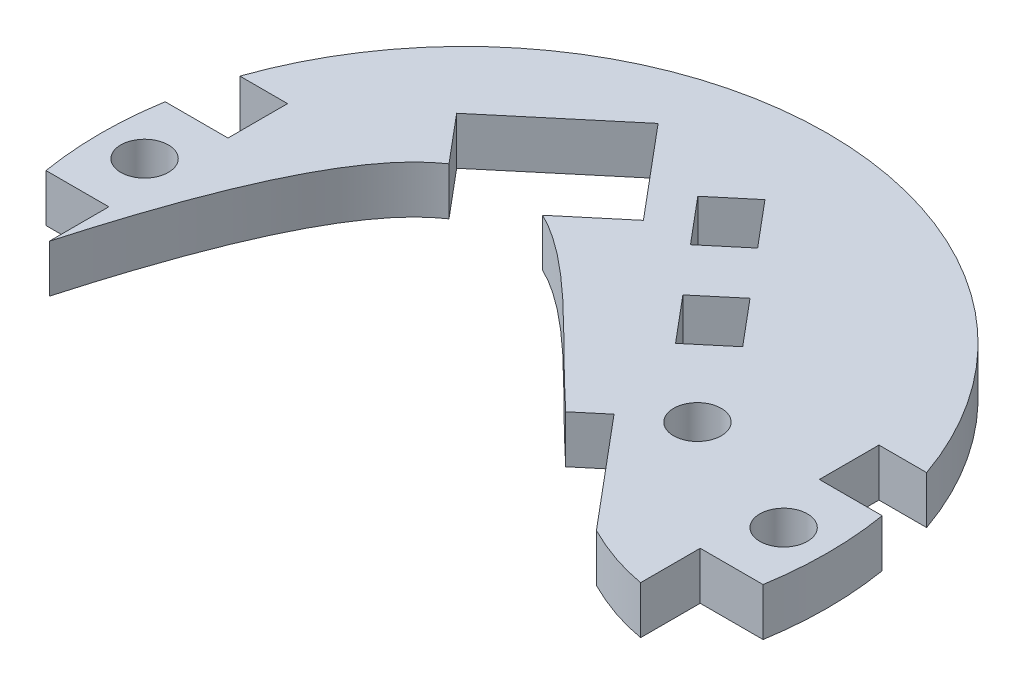
ISO-10303-21;
HEADER;
FILE_DESCRIPTION(('STEP AP214'),'2;1');
FILE_NAME('part.step','',(''),(''),'','','');
FILE_SCHEMA(('AUTOMOTIVE_DESIGN { 1 0 10303 214 1 1 1 1 }'));
ENDSEC;
DATA;
#1=APPLICATION_CONTEXT('core data for automotive mechanical design processes');
#2=APPLICATION_PROTOCOL_DEFINITION('international standard','automotive_design',2000,#1);
#3=PRODUCT_CONTEXT('',#1,'mechanical');
#4=PRODUCT('Part','Part','',(#3));
#5=PRODUCT_RELATED_PRODUCT_CATEGORY('part','',(#4));
#6=PRODUCT_DEFINITION_FORMATION('','',#4);
#7=PRODUCT_DEFINITION_CONTEXT('part definition',#1,'design');
#8=PRODUCT_DEFINITION('design','',#6,#7);
#9=PRODUCT_DEFINITION_SHAPE('','',#8);
#10=(LENGTH_UNIT() NAMED_UNIT(*) SI_UNIT(.MILLI.,.METRE.));
#11=(NAMED_UNIT(*) PLANE_ANGLE_UNIT() SI_UNIT($,.RADIAN.));
#12=(NAMED_UNIT(*) SI_UNIT($,.STERADIAN.) SOLID_ANGLE_UNIT());
#13=UNCERTAINTY_MEASURE_WITH_UNIT(LENGTH_MEASURE(1.E-05),#10,'distance_accuracy_value','');
#14=(GEOMETRIC_REPRESENTATION_CONTEXT(3) GLOBAL_UNCERTAINTY_ASSIGNED_CONTEXT((#13)) GLOBAL_UNIT_ASSIGNED_CONTEXT((#10,
#11,#12)) REPRESENTATION_CONTEXT('',''));
#15=CARTESIAN_POINT('',(0.,0.,0.));
#16=DIRECTION('',(0.,0.,1.));
#17=DIRECTION('',(1.,0.,0.));
#18=AXIS2_PLACEMENT_3D('',#15,#16,#17);
#19=CARTESIAN_POINT('',(0.,4.,0.));
#20=DIRECTION('',(0.,1.,0.));
#21=DIRECTION('',(0.,0.,1.));
#22=AXIS2_PLACEMENT_3D('',#19,#20,#21);
#23=PLANE('',#22);
#24=CARTESIAN_POINT('',(-26.8140590684478,4.,0.));
#25=DIRECTION('',(0.,1.,0.));
#26=DIRECTION('',(0.,0.,1.));
#27=AXIS2_PLACEMENT_3D('',#24,#25,#26);
#28=CIRCLE('',#27,2.);
#29=CARTESIAN_POINT('',(-26.8140590684478,4.,2.));
#30=VERTEX_POINT('',#29);
#31=EDGE_CURVE('E511',#30,#30,#28,.T.);
#32=ORIENTED_EDGE('',*,*,#31,.F.);
#33=EDGE_LOOP('',(#32));
#34=FACE_BOUND('',#33,.T.);
#35=CARTESIAN_POINT('',(26.8140590684478,4.,0.));
#36=DIRECTION('',(0.,1.,0.));
#37=DIRECTION('',(0.,0.,1.));
#38=AXIS2_PLACEMENT_3D('',#35,#36,#37);
#39=CIRCLE('',#38,2.);
#40=CARTESIAN_POINT('',(26.8140590684478,4.,2.));
#41=VERTEX_POINT('',#40);
#42=EDGE_CURVE('E506',#41,#41,#39,.T.);
#43=ORIENTED_EDGE('',*,*,#42,.F.);
#44=EDGE_LOOP('',(#43));
#45=FACE_BOUND('',#44,.T.);
#46=DIRECTION('',(0.642787609686539,0.,0.766044443118978));
#47=VECTOR('',#46,1.);
#48=CARTESIAN_POINT('',(12.6397333114632,4.,-10.6059955598279));
#49=LINE('',#48,#47);
#50=CARTESIAN_POINT('',(2.19443465405687,4.,-23.0542177605114));
#51=VERTEX_POINT('',#50);
#52=CARTESIAN_POINT('',(5.40837270248957,4.,-19.2239955449165));
#53=VERTEX_POINT('',#52);
#54=EDGE_CURVE('E525',#51,#53,#49,.T.);
#55=ORIENTED_EDGE('',*,*,#54,.T.);
#56=DIRECTION('',(-0.766044443118978,0.,0.64278760968654));
#57=VECTOR('',#56,1.);
#58=CARTESIAN_POINT('',(-7.23136060897363,4.,-8.61799998508857));
#59=LINE('',#58,#57);
#60=CARTESIAN_POINT('',(2.34419493001365,4.,-16.6528451061704));
#61=VERTEX_POINT('',#60);
#62=EDGE_CURVE('E580',#53,#61,#59,.T.);
#63=ORIENTED_EDGE('',*,*,#62,.T.);
#64=DIRECTION('',(0.64278760968654,0.,0.766044443118978));
#65=VECTOR('',#64,1.);
#66=CARTESIAN_POINT('',(9.57555553898728,4.,-8.0348451210818));
#67=LINE('',#66,#65);
#68=CARTESIAN_POINT('',(-0.869743118419048,4.,-20.4830673217653));
#69=VERTEX_POINT('',#68);
#70=EDGE_CURVE('E595',#69,#61,#67,.T.);
#71=ORIENTED_EDGE('',*,*,#70,.F.);
#72=DIRECTION('',(-0.766044443118979,0.,0.642787609686538));
#73=VECTOR('',#72,1.);
#74=CARTESIAN_POINT('',(-10.4452986574063,4.,-12.4482222006835));
#75=LINE('',#74,#73);
#76=EDGE_CURVE('E605',#51,#69,#75,.T.);
#77=ORIENTED_EDGE('',*,*,#76,.F.);
#78=EDGE_LOOP('',(#55,#63,#71,#77));
#79=FACE_BOUND('',#78,.T.);
#80=CARTESIAN_POINT('',(24.8140590684478,4.,10.));
#81=CARTESIAN_POINT('',(2.60810022644381,4.,6.09954088109175));
#82=CARTESIAN_POINT('',(-10.3265066637411,4.,-41.1093024675528));
#83=CARTESIAN_POINT('',(-24.8140590684478,4.,10.));
#84=B_SPLINE_CURVE_WITH_KNOTS('',3,(#80,#81,#82,#83),.UNSPECIFIED.,.F.,.F.,(4,4),(0.,1.),.UNSPECIFIED.);
#85=CARTESIAN_POINT('',(-13.6660144702661,4.,-12.3972122742331));
#86=VERTEX_POINT('',#85);
#87=CARTESIAN_POINT('',(-24.8140590684478,4.,10.));
#88=VERTEX_POINT('',#87);
#89=EDGE_CURVE('E377',#86,#88,#84,.T.);
#90=ORIENTED_EDGE('',*,*,#89,.F.);
#91=DIRECTION('',(-0.64278760968654,0.,-0.766044443118977));
#92=VECTOR('',#91,1.);
#93=CARTESIAN_POINT('',(-1.91511110779738,4.,1.6069690242163));
#94=LINE('',#93,#92);
#95=CARTESIAN_POINT('',(-17.0206199354311,4.,-16.3950753890797));
#96=VERTEX_POINT('',#95);
#97=EDGE_CURVE('E387',#86,#96,#94,.T.);
#98=ORIENTED_EDGE('',*,*,#97,.T.);
#99=DIRECTION('',(-0.766044443118978,0.,0.64278760968654));
#100=VECTOR('',#99,1.);
#101=CARTESIAN_POINT('',(-15.1055088276337,4.,-18.002044413296));
#102=LINE('',#101,#100);
#103=CARTESIAN_POINT('',(-7.82808661800334,4.,-24.1085267053181));
#104=VERTEX_POINT('',#103);
#105=EDGE_CURVE('E568',#104,#96,#102,.T.);
#106=ORIENTED_EDGE('',*,*,#105,.F.);
#107=DIRECTION('',(-0.64278760968654,0.,-0.766044443118977));
#108=VECTOR('',#107,1.);
#109=CARTESIAN_POINT('',(7.27742220963035,4.,-6.10648229202218));
#110=LINE('',#109,#108);
#111=CARTESIAN_POINT('',(-1.40021052113794,4.,-16.4480822741284));
#112=VERTEX_POINT('',#111);
#113=EDGE_CURVE('E560',#112,#104,#110,.T.);
#114=ORIENTED_EDGE('',*,*,#113,.F.);
#115=DIRECTION('',(-0.766044443118977,0.,0.642787609686541));
#116=VECTOR('',#115,1.);
#117=CARTESIAN_POINT('',(-8.67763273076829,4.,-10.3415999821062));
#118=LINE('',#117,#116);
#119=CARTESIAN_POINT('',(-5.996477179867,4.,-12.5913566159964));
#120=VERTEX_POINT('',#119);
#121=EDGE_CURVE('E569',#112,#120,#118,.T.);
#122=ORIENTED_EDGE('',*,*,#121,.T.);
#123=CARTESIAN_POINT('',(9.24867851454461,4.,0.724584650228196));
#124=VERTEX_POINT('',#123);
#125=EDGE_CURVE('E776',#124,#120,#84,.T.);
#126=ORIENTED_EDGE('',*,*,#125,.F.);
#127=DIRECTION('',(-0.766044443118977,0.,0.64278760968654));
#128=VECTOR('',#127,1.);
#129=CARTESIAN_POINT('',(4.17811946296252,4.,4.97928888027336));
#130=LINE('',#129,#128);
#131=CARTESIAN_POINT('',(11.4555416725929,4.,-1.12719341174882));
#132=VERTEX_POINT('',#131);
#133=EDGE_CURVE('E782',#132,#124,#130,.T.);
#134=ORIENTED_EDGE('',*,*,#133,.F.);
#135=DIRECTION('',(0.64278760968654,0.,0.766044443118977));
#136=VECTOR('',#135,1.);
#137=CARTESIAN_POINT('',(7.27742220963035,4.,-6.10648229202218));
#138=LINE('',#137,#136);
#139=CARTESIAN_POINT('',(19.1689929888313,4.,8.0653399056789));
#140=VERTEX_POINT('',#139);
#141=EDGE_CURVE('E777',#132,#140,#138,.T.);
#142=ORIENTED_EDGE('',*,*,#141,.T.);
#143=CARTESIAN_POINT('',(24.8140590684478,4.,10.));
#144=VERTEX_POINT('',#143);
#145=EDGE_CURVE('E754',#144,#140,#84,.T.);
#146=ORIENTED_EDGE('',*,*,#145,.F.);
#147=DIRECTION('',(0.,0.,1.));
#148=VECTOR('',#147,1.);
#149=CARTESIAN_POINT('',(24.8140590684478,4.,0.));
#150=LINE('',#149,#148);
#151=CARTESIAN_POINT('',(24.8140590684478,4.,5.));
#152=VERTEX_POINT('',#151);
#153=EDGE_CURVE('E612',#152,#144,#150,.T.);
#154=ORIENTED_EDGE('',*,*,#153,.F.);
#155=DIRECTION('',(1.,0.,0.));
#156=VECTOR('',#155,1.);
#157=CARTESIAN_POINT('',(0.,4.,5.));
#158=LINE('',#157,#156);
#159=CARTESIAN_POINT('',(30.0873727666608,4.,5.));
#160=VERTEX_POINT('',#159);
#161=EDGE_CURVE('E623',#152,#160,#158,.T.);
#162=ORIENTED_EDGE('',*,*,#161,.T.);
#163=CARTESIAN_POINT('',(0.,4.,0.));
#164=DIRECTION('',(0.,1.,0.));
#165=DIRECTION('',(0.,0.,1.));
#166=AXIS2_PLACEMENT_3D('',#163,#164,#165);
#167=CIRCLE('',#166,30.5);
#168=CARTESIAN_POINT('',(30.0873727666608,4.,-5.));
#169=VERTEX_POINT('',#168);
#170=EDGE_CURVE('E706',#160,#169,#167,.T.);
#171=ORIENTED_EDGE('',*,*,#170,.T.);
#172=DIRECTION('',(1.,0.,0.));
#173=VECTOR('',#172,1.);
#174=CARTESIAN_POINT('',(0.,4.,-5.00000000000001));
#175=LINE('',#174,#173);
#176=CARTESIAN_POINT('',(24.8140590684478,4.,-5.));
#177=VERTEX_POINT('',#176);
#178=EDGE_CURVE('E639',#177,#169,#175,.T.);
#179=ORIENTED_EDGE('',*,*,#178,.F.);
#180=DIRECTION('',(0.,0.,-1.));
#181=VECTOR('',#180,1.);
#182=CARTESIAN_POINT('',(24.8140590684478,4.,0.));
#183=LINE('',#182,#181);
#184=CARTESIAN_POINT('',(24.8140590684478,4.,-10.));
#185=VERTEX_POINT('',#184);
#186=EDGE_CURVE('E647',#177,#185,#183,.T.);
#187=ORIENTED_EDGE('',*,*,#186,.T.);
#188=DIRECTION('',(1.,0.,0.));
#189=VECTOR('',#188,1.);
#190=CARTESIAN_POINT('',(0.,4.,-10.));
#191=LINE('',#190,#189);
#192=CARTESIAN_POINT('',(28.8140590684478,4.,-10.));
#193=VERTEX_POINT('',#192);
#194=EDGE_CURVE('E632',#185,#193,#191,.T.);
#195=ORIENTED_EDGE('',*,*,#194,.T.);
#196=CARTESIAN_POINT('',(-28.8140590684478,4.,-10.));
#197=VERTEX_POINT('',#196);
#198=EDGE_CURVE('E708',#193,#197,#167,.T.);
#199=ORIENTED_EDGE('',*,*,#198,.T.);
#200=DIRECTION('',(-1.,0.,0.));
#201=VECTOR('',#200,1.);
#202=CARTESIAN_POINT('',(0.,4.,-10.));
#203=LINE('',#202,#201);
#204=CARTESIAN_POINT('',(-24.8140590684478,4.,-10.));
#205=VERTEX_POINT('',#204);
#206=EDGE_CURVE('E664',#205,#197,#203,.T.);
#207=ORIENTED_EDGE('',*,*,#206,.F.);
#208=DIRECTION('',(0.,0.,-1.));
#209=VECTOR('',#208,1.);
#210=CARTESIAN_POINT('',(-24.8140590684478,4.,0.));
#211=LINE('',#210,#209);
#212=CARTESIAN_POINT('',(-24.8140590684478,4.,-5.));
#213=VERTEX_POINT('',#212);
#214=EDGE_CURVE('E673',#213,#205,#211,.T.);
#215=ORIENTED_EDGE('',*,*,#214,.F.);
#216=DIRECTION('',(-1.,0.,0.));
#217=VECTOR('',#216,1.);
#218=CARTESIAN_POINT('',(0.,4.,-5.));
#219=LINE('',#218,#217);
#220=CARTESIAN_POINT('',(-30.0873727666608,4.,-5.));
#221=VERTEX_POINT('',#220);
#222=EDGE_CURVE('E654',#213,#221,#219,.T.);
#223=ORIENTED_EDGE('',*,*,#222,.T.);
#224=CARTESIAN_POINT('',(-30.0873727666608,4.,5.));
#225=VERTEX_POINT('',#224);
#226=EDGE_CURVE('E709',#221,#225,#167,.T.);
#227=ORIENTED_EDGE('',*,*,#226,.T.);
#228=DIRECTION('',(-1.,0.,0.));
#229=VECTOR('',#228,1.);
#230=CARTESIAN_POINT('',(0.,4.,5.00000000000001));
#231=LINE('',#230,#229);
#232=CARTESIAN_POINT('',(-24.8140590684478,4.,5.));
#233=VERTEX_POINT('',#232);
#234=EDGE_CURVE('E680',#233,#225,#231,.T.);
#235=ORIENTED_EDGE('',*,*,#234,.F.);
#236=DIRECTION('',(0.,0.,1.));
#237=VECTOR('',#236,1.);
#238=CARTESIAN_POINT('',(-24.8140590684478,4.,0.));
#239=LINE('',#238,#237);
#240=EDGE_CURVE('E691',#233,#88,#239,.T.);
#241=ORIENTED_EDGE('',*,*,#240,.T.);
#242=EDGE_LOOP('',(#90,#98,#106,#114,#122,#126,#134,#142,#146,#154,#162,#171,#179,#187,#195,
#199,#207,#215,#223,#227,#235,#241));
#243=FACE_BOUND('',#242,.T.);
#244=CARTESIAN_POINT('',(15.5268092418202,4.,-4.05386479401187));
#245=DIRECTION('',(0.,1.,0.));
#246=DIRECTION('',(0.,0.,1.));
#247=AXIS2_PLACEMENT_3D('',#244,#245,#246);
#248=CIRCLE('',#247,2.);
#249=CARTESIAN_POINT('',(15.5268092418202,4.,-2.05386479401187));
#250=VERTEX_POINT('',#249);
#251=EDGE_CURVE('E371',#250,#250,#248,.T.);
#252=ORIENTED_EDGE('',*,*,#251,.F.);
#253=EDGE_LOOP('',(#252));
#254=FACE_BOUND('',#253,.T.);
#255=DIRECTION('',(-0.766044443118977,0.,0.642787609686541));
#256=VECTOR('',#255,1.);
#257=CARTESIAN_POINT('',(-3.90227068691144,4.,-4.65054511040176));
#258=LINE('',#257,#256);
#259=CARTESIAN_POINT('',(8.73746262455176,4.,-15.2565406702297));
#260=VERTEX_POINT('',#259);
#261=CARTESIAN_POINT('',(5.67328485207585,4.,-12.6853902314836));
#262=VERTEX_POINT('',#261);
#263=EDGE_CURVE('E359',#260,#262,#258,.T.);
#264=ORIENTED_EDGE('',*,*,#263,.F.);
#265=DIRECTION('',(0.64278760968654,0.,0.766044443118977));
#266=VECTOR('',#265,1.);
#267=CARTESIAN_POINT('',(12.6397333114632,4.,-10.605995559828));
#268=LINE('',#267,#266);
#269=CARTESIAN_POINT('',(11.9514006729845,4.,-11.4263184546349));
#270=VERTEX_POINT('',#269);
#271=EDGE_CURVE('E166',#260,#270,#268,.T.);
#272=ORIENTED_EDGE('',*,*,#271,.T.);
#273=DIRECTION('',(-0.766044443118978,0.,0.64278760968654));
#274=VECTOR('',#273,1.);
#275=CARTESIAN_POINT('',(-0.688332638478748,4.,-0.820322894806898));
#276=LINE('',#275,#274);
#277=CARTESIAN_POINT('',(8.88722290050855,4.,-8.8551680158887));
#278=VERTEX_POINT('',#277);
#279=EDGE_CURVE('E364',#270,#278,#276,.T.);
#280=ORIENTED_EDGE('',*,*,#279,.T.);
#281=DIRECTION('',(0.64278760968654,0.,0.766044443118977));
#282=VECTOR('',#281,1.);
#283=CARTESIAN_POINT('',(9.57555553898729,4.,-8.03484512108181));
#284=LINE('',#283,#282);
#285=EDGE_CURVE('E350',#262,#278,#284,.T.);
#286=ORIENTED_EDGE('',*,*,#285,.F.);
#287=EDGE_LOOP('',(#264,#272,#280,#286));
#288=FACE_BOUND('',#287,.T.);
#289=ADVANCED_FACE('F151',(#34,#45,#79,#243,#254,#288),#23,.T.);
#290=CARTESIAN_POINT('',(0.,0.,0.));
#291=DIRECTION('',(0.,1.,0.));
#292=DIRECTION('',(0.,0.,1.));
#293=AXIS2_PLACEMENT_3D('',#290,#291,#292);
#294=PLANE('',#293);
#295=CARTESIAN_POINT('',(-26.8140590684478,0.,0.));
#296=DIRECTION('',(0.,1.,0.));
#297=DIRECTION('',(0.,0.,1.));
#298=AXIS2_PLACEMENT_3D('',#295,#296,#297);
#299=CIRCLE('',#298,2.);
#300=CARTESIAN_POINT('',(-26.8140590684478,0.,2.));
#301=VERTEX_POINT('',#300);
#302=EDGE_CURVE('E483',#301,#301,#299,.T.);
#303=ORIENTED_EDGE('',*,*,#302,.T.);
#304=EDGE_LOOP('',(#303));
#305=FACE_BOUND('',#304,.T.);
#306=CARTESIAN_POINT('',(26.8140590684478,0.,0.));
#307=DIRECTION('',(0.,1.,0.));
#308=DIRECTION('',(0.,0.,1.));
#309=AXIS2_PLACEMENT_3D('',#306,#307,#308);
#310=CIRCLE('',#309,2.);
#311=CARTESIAN_POINT('',(26.8140590684478,0.,2.));
#312=VERTEX_POINT('',#311);
#313=EDGE_CURVE('E487',#312,#312,#310,.T.);
#314=ORIENTED_EDGE('',*,*,#313,.T.);
#315=EDGE_LOOP('',(#314));
#316=FACE_BOUND('',#315,.T.);
#317=DIRECTION('',(-0.766044443118978,0.,0.64278760968654));
#318=VECTOR('',#317,1.);
#319=CARTESIAN_POINT('',(-7.23136060897363,0.,-8.61799998508857));
#320=LINE('',#319,#318);
#321=CARTESIAN_POINT('',(5.40837270248956,0.,-19.2239955449165));
#322=VERTEX_POINT('',#321);
#323=CARTESIAN_POINT('',(2.34419493001365,0.,-16.6528451061704));
#324=VERTEX_POINT('',#323);
#325=EDGE_CURVE('E492',#322,#324,#320,.T.);
#326=ORIENTED_EDGE('',*,*,#325,.F.);
#327=DIRECTION('',(0.642787609686539,0.,0.766044443118978));
#328=VECTOR('',#327,1.);
#329=CARTESIAN_POINT('',(12.6397333114632,0.,-10.6059955598279));
#330=LINE('',#329,#328);
#331=CARTESIAN_POINT('',(2.19443465405687,0.,-23.0542177605114));
#332=VERTEX_POINT('',#331);
#333=EDGE_CURVE('E594',#332,#322,#330,.T.);
#334=ORIENTED_EDGE('',*,*,#333,.F.);
#335=DIRECTION('',(-0.766044443118979,0.,0.642787609686538));
#336=VECTOR('',#335,1.);
#337=CARTESIAN_POINT('',(-10.4452986574063,0.,-12.4482222006835));
#338=LINE('',#337,#336);
#339=CARTESIAN_POINT('',(-0.869743118419048,0.,-20.4830673217653));
#340=VERTEX_POINT('',#339);
#341=EDGE_CURVE('E597',#332,#340,#338,.T.);
#342=ORIENTED_EDGE('',*,*,#341,.T.);
#343=DIRECTION('',(0.64278760968654,0.,0.766044443118978));
#344=VECTOR('',#343,1.);
#345=CARTESIAN_POINT('',(9.57555553898728,0.,-8.0348451210818));
#346=LINE('',#345,#344);
#347=EDGE_CURVE('E600',#340,#324,#346,.T.);
#348=ORIENTED_EDGE('',*,*,#347,.T.);
#349=EDGE_LOOP('',(#326,#334,#342,#348));
#350=FACE_BOUND('',#349,.T.);
#351=DIRECTION('',(-0.64278760968654,0.,-0.766044443118977));
#352=VECTOR('',#351,1.);
#353=CARTESIAN_POINT('',(-1.91511110779738,0.,1.6069690242163));
#354=LINE('',#353,#352);
#355=CARTESIAN_POINT('',(-13.6660144702661,0.,-12.3972122742331));
#356=VERTEX_POINT('',#355);
#357=CARTESIAN_POINT('',(-17.0206199354311,0.,-16.3950753890797));
#358=VERTEX_POINT('',#357);
#359=EDGE_CURVE('E496',#356,#358,#354,.T.);
#360=ORIENTED_EDGE('',*,*,#359,.F.);
#361=CARTESIAN_POINT('',(24.8140590684478,0.,10.));
#362=CARTESIAN_POINT('',(2.60810022644381,0.,6.09954088109175));
#363=CARTESIAN_POINT('',(-10.3265066637411,0.,-41.1093024675528));
#364=CARTESIAN_POINT('',(-24.8140590684478,0.,10.));
#365=B_SPLINE_CURVE_WITH_KNOTS('',3,(#361,#362,#363,#364),.UNSPECIFIED.,.F.,.F.,(4,4),(0.,1.),.UNSPECIFIED.);
#366=CARTESIAN_POINT('',(-24.8140590684478,0.,10.));
#367=VERTEX_POINT('',#366);
#368=EDGE_CURVE('E380',#356,#367,#365,.T.);
#369=ORIENTED_EDGE('',*,*,#368,.T.);
#370=DIRECTION('',(0.,0.,1.));
#371=VECTOR('',#370,1.);
#372=CARTESIAN_POINT('',(-24.8140590684478,0.,0.));
#373=LINE('',#372,#371);
#374=CARTESIAN_POINT('',(-24.8140590684478,0.,5.));
#375=VERTEX_POINT('',#374);
#376=EDGE_CURVE('E690',#375,#367,#373,.T.);
#377=ORIENTED_EDGE('',*,*,#376,.F.);
#378=DIRECTION('',(-1.,0.,0.));
#379=VECTOR('',#378,1.);
#380=CARTESIAN_POINT('',(0.,0.,5.00000000000001));
#381=LINE('',#380,#379);
#382=CARTESIAN_POINT('',(-30.0873727666608,0.,5.));
#383=VERTEX_POINT('',#382);
#384=EDGE_CURVE('E687',#375,#383,#381,.T.);
#385=ORIENTED_EDGE('',*,*,#384,.T.);
#386=CARTESIAN_POINT('',(0.,0.,0.));
#387=DIRECTION('',(0.,1.,0.));
#388=DIRECTION('',(0.,0.,1.));
#389=AXIS2_PLACEMENT_3D('',#386,#387,#388);
#390=CIRCLE('',#389,30.5);
#391=CARTESIAN_POINT('',(-30.0873727666608,0.,-5.));
#392=VERTEX_POINT('',#391);
#393=EDGE_CURVE('E700',#392,#383,#390,.T.);
#394=ORIENTED_EDGE('',*,*,#393,.F.);
#395=DIRECTION('',(-1.,0.,0.));
#396=VECTOR('',#395,1.);
#397=CARTESIAN_POINT('',(0.,0.,-5.));
#398=LINE('',#397,#396);
#399=CARTESIAN_POINT('',(-24.8140590684478,0.,-5.));
#400=VERTEX_POINT('',#399);
#401=EDGE_CURVE('E661',#400,#392,#398,.T.);
#402=ORIENTED_EDGE('',*,*,#401,.F.);
#403=DIRECTION('',(0.,0.,-1.));
#404=VECTOR('',#403,1.);
#405=CARTESIAN_POINT('',(-24.8140590684478,0.,0.));
#406=LINE('',#405,#404);
#407=CARTESIAN_POINT('',(-24.8140590684478,0.,-10.));
#408=VERTEX_POINT('',#407);
#409=EDGE_CURVE('E663',#400,#408,#406,.T.);
#410=ORIENTED_EDGE('',*,*,#409,.T.);
#411=DIRECTION('',(-1.,0.,0.));
#412=VECTOR('',#411,1.);
#413=CARTESIAN_POINT('',(0.,0.,-10.));
#414=LINE('',#413,#412);
#415=CARTESIAN_POINT('',(-28.8140590684478,0.,-10.));
#416=VERTEX_POINT('',#415);
#417=EDGE_CURVE('E667',#408,#416,#414,.T.);
#418=ORIENTED_EDGE('',*,*,#417,.T.);
#419=CARTESIAN_POINT('',(28.8140590684478,0.,-10.));
#420=VERTEX_POINT('',#419);
#421=EDGE_CURVE('E712',#420,#416,#390,.T.);
#422=ORIENTED_EDGE('',*,*,#421,.F.);
#423=DIRECTION('',(1.,0.,0.));
#424=VECTOR('',#423,1.);
#425=CARTESIAN_POINT('',(0.,0.,-10.));
#426=LINE('',#425,#424);
#427=CARTESIAN_POINT('',(24.8140590684478,0.,-10.));
#428=VERTEX_POINT('',#427);
#429=EDGE_CURVE('E636',#428,#420,#426,.T.);
#430=ORIENTED_EDGE('',*,*,#429,.F.);
#431=DIRECTION('',(0.,0.,-1.));
#432=VECTOR('',#431,1.);
#433=CARTESIAN_POINT('',(24.8140590684478,0.,0.));
#434=LINE('',#433,#432);
#435=CARTESIAN_POINT('',(24.8140590684478,0.,-5.));
#436=VERTEX_POINT('',#435);
#437=EDGE_CURVE('E638',#436,#428,#434,.T.);
#438=ORIENTED_EDGE('',*,*,#437,.F.);
#439=DIRECTION('',(1.,0.,0.));
#440=VECTOR('',#439,1.);
#441=CARTESIAN_POINT('',(0.,0.,-5.00000000000001));
#442=LINE('',#441,#440);
#443=CARTESIAN_POINT('',(30.0873727666608,0.,-5.));
#444=VERTEX_POINT('',#443);
#445=EDGE_CURVE('E641',#436,#444,#442,.T.);
#446=ORIENTED_EDGE('',*,*,#445,.T.);
#447=CARTESIAN_POINT('',(30.0873727666608,0.,5.));
#448=VERTEX_POINT('',#447);
#449=EDGE_CURVE('E710',#448,#444,#390,.T.);
#450=ORIENTED_EDGE('',*,*,#449,.F.);
#451=DIRECTION('',(1.,0.,0.));
#452=VECTOR('',#451,1.);
#453=CARTESIAN_POINT('',(0.,0.,5.));
#454=LINE('',#453,#452);
#455=CARTESIAN_POINT('',(24.8140590684478,0.,5.));
#456=VERTEX_POINT('',#455);
#457=EDGE_CURVE('E622',#456,#448,#454,.T.);
#458=ORIENTED_EDGE('',*,*,#457,.F.);
#459=DIRECTION('',(0.,0.,1.));
#460=VECTOR('',#459,1.);
#461=CARTESIAN_POINT('',(24.8140590684478,0.,0.));
#462=LINE('',#461,#460);
#463=CARTESIAN_POINT('',(24.8140590684478,0.,10.));
#464=VERTEX_POINT('',#463);
#465=EDGE_CURVE('E619',#456,#464,#462,.T.);
#466=ORIENTED_EDGE('',*,*,#465,.T.);
#467=CARTESIAN_POINT('',(19.1689929888313,0.,8.0653399056789));
#468=VERTEX_POINT('',#467);
#469=EDGE_CURVE('E386',#464,#468,#365,.T.);
#470=ORIENTED_EDGE('',*,*,#469,.T.);
#471=DIRECTION('',(0.64278760968654,0.,0.766044443118977));
#472=VECTOR('',#471,1.);
#473=CARTESIAN_POINT('',(7.27742220963035,0.,-6.10648229202218));
#474=LINE('',#473,#472);
#475=CARTESIAN_POINT('',(11.4555416725929,0.,-1.12719341174882));
#476=VERTEX_POINT('',#475);
#477=EDGE_CURVE('E389',#476,#468,#474,.T.);
#478=ORIENTED_EDGE('',*,*,#477,.F.);
#479=DIRECTION('',(-0.766044443118977,0.,0.64278760968654));
#480=VECTOR('',#479,1.);
#481=CARTESIAN_POINT('',(4.17811946296252,0.,4.97928888027336));
#482=LINE('',#481,#480);
#483=CARTESIAN_POINT('',(9.24867851454461,0.,0.724584650228196));
#484=VERTEX_POINT('',#483);
#485=EDGE_CURVE('E758',#476,#484,#482,.T.);
#486=ORIENTED_EDGE('',*,*,#485,.T.);
#487=CARTESIAN_POINT('',(-5.996477179867,0.,-12.5913566159964));
#488=VERTEX_POINT('',#487);
#489=EDGE_CURVE('E388',#484,#488,#365,.T.);
#490=ORIENTED_EDGE('',*,*,#489,.T.);
#491=DIRECTION('',(-0.766044443118977,0.,0.642787609686541));
#492=VECTOR('',#491,1.);
#493=CARTESIAN_POINT('',(-8.67763273076829,0.,-10.3415999821062));
#494=LINE('',#493,#492);
#495=CARTESIAN_POINT('',(-1.40021052113794,0.,-16.4480822741284));
#496=VERTEX_POINT('',#495);
#497=EDGE_CURVE('E760',#496,#488,#494,.T.);
#498=ORIENTED_EDGE('',*,*,#497,.F.);
#499=DIRECTION('',(-0.64278760968654,0.,-0.766044443118977));
#500=VECTOR('',#499,1.);
#501=CARTESIAN_POINT('',(7.27742220963035,0.,-6.10648229202218));
#502=LINE('',#501,#500);
#503=CARTESIAN_POINT('',(-7.82808661800334,0.,-24.1085267053181));
#504=VERTEX_POINT('',#503);
#505=EDGE_CURVE('E764',#496,#504,#502,.T.);
#506=ORIENTED_EDGE('',*,*,#505,.T.);
#507=DIRECTION('',(-0.766044443118978,0.,0.64278760968654));
#508=VECTOR('',#507,1.);
#509=CARTESIAN_POINT('',(-15.1055088276337,0.,-18.002044413296));
#510=LINE('',#509,#508);
#511=EDGE_CURVE('E770',#504,#358,#510,.T.);
#512=ORIENTED_EDGE('',*,*,#511,.T.);
#513=EDGE_LOOP('',(#360,#369,#377,#385,#394,#402,#410,#418,#422,#430,#438,#446,#450,#458,#466,
#470,#478,#486,#490,#498,#506,#512));
#514=FACE_BOUND('',#513,.T.);
#515=CARTESIAN_POINT('',(15.5268092418202,0.,-4.05386479401187));
#516=DIRECTION('',(0.,1.,0.));
#517=DIRECTION('',(0.,0.,1.));
#518=AXIS2_PLACEMENT_3D('',#515,#516,#517);
#519=CIRCLE('',#518,2.);
#520=CARTESIAN_POINT('',(15.5268092418202,0.,-2.05386479401187));
#521=VERTEX_POINT('',#520);
#522=EDGE_CURVE('E374',#521,#521,#519,.T.);
#523=ORIENTED_EDGE('',*,*,#522,.T.);
#524=EDGE_LOOP('',(#523));
#525=FACE_BOUND('',#524,.T.);
#526=DIRECTION('',(0.64278760968654,0.,0.766044443118977));
#527=VECTOR('',#526,1.);
#528=CARTESIAN_POINT('',(12.6397333114632,0.,-10.605995559828));
#529=LINE('',#528,#527);
#530=CARTESIAN_POINT('',(8.73746262455176,0.,-15.2565406702297));
#531=VERTEX_POINT('',#530);
#532=CARTESIAN_POINT('',(11.9514006729845,0.,-11.4263184546349));
#533=VERTEX_POINT('',#532);
#534=EDGE_CURVE('E12',#531,#533,#529,.T.);
#535=ORIENTED_EDGE('',*,*,#534,.F.);
#536=DIRECTION('',(-0.766044443118977,0.,0.642787609686541));
#537=VECTOR('',#536,1.);
#538=CARTESIAN_POINT('',(-3.90227068691144,0.,-4.65054511040176));
#539=LINE('',#538,#537);
#540=CARTESIAN_POINT('',(5.67328485207585,0.,-12.6853902314836));
#541=VERTEX_POINT('',#540);
#542=EDGE_CURVE('E501',#531,#541,#539,.T.);
#543=ORIENTED_EDGE('',*,*,#542,.T.);
#544=DIRECTION('',(0.64278760968654,0.,0.766044443118977));
#545=VECTOR('',#544,1.);
#546=CARTESIAN_POINT('',(9.57555553898729,0.,-8.03484512108181));
#547=LINE('',#546,#545);
#548=CARTESIAN_POINT('',(8.88722290050855,0.,-8.8551680158887));
#549=VERTEX_POINT('',#548);
#550=EDGE_CURVE('E353',#541,#549,#547,.T.);
#551=ORIENTED_EDGE('',*,*,#550,.T.);
#552=DIRECTION('',(-0.766044443118978,0.,0.64278760968654));
#553=VECTOR('',#552,1.);
#554=CARTESIAN_POINT('',(-0.688332638478748,0.,-0.820322894806898));
#555=LINE('',#554,#553);
#556=EDGE_CURVE('E159',#533,#549,#555,.T.);
#557=ORIENTED_EDGE('',*,*,#556,.F.);
#558=EDGE_LOOP('',(#535,#543,#551,#557));
#559=FACE_BOUND('',#558,.T.);
#560=ADVANCED_FACE('F470',(#305,#316,#350,#514,#525,#559),#294,.F.);
#561=CARTESIAN_POINT('',(0.,4.,0.));
#562=DIRECTION('',(0.,-1.,0.));
#563=DIRECTION('',(0.,0.,-1.));
#564=AXIS2_PLACEMENT_3D('',#561,#562,#563);
#565=CYLINDRICAL_SURFACE('',#564,30.5);
#566=DIRECTION('',(0.,1.,0.));
#567=VECTOR('',#566,1.);
#568=CARTESIAN_POINT('',(30.0873727666608,0.,5.));
#569=LINE('',#568,#567);
#570=EDGE_CURVE('E633',#448,#160,#569,.T.);
#571=ORIENTED_EDGE('',*,*,#570,.F.);
#572=ORIENTED_EDGE('',*,*,#449,.T.);
#573=DIRECTION('',(0.,1.,0.));
#574=VECTOR('',#573,1.);
#575=CARTESIAN_POINT('',(30.0873727666608,0.,-5.));
#576=LINE('',#575,#574);
#577=EDGE_CURVE('E655',#444,#169,#576,.T.);
#578=ORIENTED_EDGE('',*,*,#577,.T.);
#579=ORIENTED_EDGE('',*,*,#170,.F.);
#580=EDGE_LOOP('',(#571,#572,#578,#579));
#581=FACE_BOUND('',#580,.T.);
#582=ADVANCED_FACE('F153',(#581),#565,.T.);
#583=DIRECTION('',(0.,1.,0.));
#584=VECTOR('',#583,1.);
#585=CARTESIAN_POINT('',(28.8140590684478,0.,-10.));
#586=LINE('',#585,#584);
#587=EDGE_CURVE('E652',#420,#193,#586,.T.);
#588=ORIENTED_EDGE('',*,*,#587,.F.);
#589=ORIENTED_EDGE('',*,*,#421,.T.);
#590=DIRECTION('',(0.,1.,0.));
#591=VECTOR('',#590,1.);
#592=CARTESIAN_POINT('',(-28.8140590684478,0.,-10.));
#593=LINE('',#592,#591);
#594=EDGE_CURVE('E681',#416,#197,#593,.T.);
#595=ORIENTED_EDGE('',*,*,#594,.T.);
#596=ORIENTED_EDGE('',*,*,#198,.F.);
#597=EDGE_LOOP('',(#588,#589,#595,#596));
#598=FACE_BOUND('',#597,.T.);
#599=ADVANCED_FACE('F478',(#598),#565,.T.);
#600=DIRECTION('',(0.,1.,0.));
#601=VECTOR('',#600,1.);
#602=CARTESIAN_POINT('',(-30.0873727666608,0.,-5.));
#603=LINE('',#602,#601);
#604=EDGE_CURVE('E678',#392,#221,#603,.T.);
#605=ORIENTED_EDGE('',*,*,#604,.F.);
#606=ORIENTED_EDGE('',*,*,#393,.T.);
#607=DIRECTION('',(0.,1.,0.));
#608=VECTOR('',#607,1.);
#609=CARTESIAN_POINT('',(-30.0873727666608,0.,5.));
#610=LINE('',#609,#608);
#611=EDGE_CURVE('E694',#383,#225,#610,.T.);
#612=ORIENTED_EDGE('',*,*,#611,.T.);
#613=ORIENTED_EDGE('',*,*,#226,.F.);
#614=EDGE_LOOP('',(#605,#606,#612,#613));
#615=FACE_BOUND('',#614,.T.);
#616=ADVANCED_FACE('F467',(#615),#565,.T.);
#617=CARTESIAN_POINT('',(0.,0.,5.00000000000001));
#618=DIRECTION('',(0.,0.,-1.));
#619=DIRECTION('',(-1.,0.,0.));
#620=AXIS2_PLACEMENT_3D('',#617,#618,#619);
#621=PLANE('',#620);
#622=ORIENTED_EDGE('',*,*,#234,.T.);
#623=ORIENTED_EDGE('',*,*,#611,.F.);
#624=ORIENTED_EDGE('',*,*,#384,.F.);
#625=DIRECTION('',(0.,1.,0.));
#626=VECTOR('',#625,1.);
#627=CARTESIAN_POINT('',(-24.8140590684478,0.,5.));
#628=LINE('',#627,#626);
#629=EDGE_CURVE('E698',#375,#233,#628,.T.);
#630=ORIENTED_EDGE('',*,*,#629,.T.);
#631=EDGE_LOOP('',(#622,#623,#624,#630));
#632=FACE_BOUND('',#631,.T.);
#633=ADVANCED_FACE('F463',(#632),#621,.F.);
#634=CARTESIAN_POINT('',(-24.8140590684478,0.,0.));
#635=DIRECTION('',(-1.,0.,0.));
#636=DIRECTION('',(0.,0.,1.));
#637=AXIS2_PLACEMENT_3D('',#634,#635,#636);
#638=PLANE('',#637);
#639=ORIENTED_EDGE('',*,*,#240,.F.);
#640=ORIENTED_EDGE('',*,*,#629,.F.);
#641=ORIENTED_EDGE('',*,*,#376,.T.);
#642=DIRECTION('',(0.,1.,0.));
#643=VECTOR('',#642,1.);
#644=CARTESIAN_POINT('',(-24.8140590684478,0.,10.));
#645=LINE('',#644,#643);
#646=EDGE_CURVE('E701',#367,#88,#645,.T.);
#647=ORIENTED_EDGE('',*,*,#646,.T.);
#648=EDGE_LOOP('',(#639,#640,#641,#647));
#649=FACE_BOUND('',#648,.T.);
#650=ADVANCED_FACE('F459',(#649),#638,.T.);
#651=CARTESIAN_POINT('',(0.,0.,-5.));
#652=DIRECTION('',(0.,0.,-1.));
#653=DIRECTION('',(-1.,0.,0.));
#654=AXIS2_PLACEMENT_3D('',#651,#652,#653);
#655=PLANE('',#654);
#656=ORIENTED_EDGE('',*,*,#222,.F.);
#657=DIRECTION('',(0.,1.,0.));
#658=VECTOR('',#657,1.);
#659=CARTESIAN_POINT('',(-24.8140590684478,0.,-5.));
#660=LINE('',#659,#658);
#661=EDGE_CURVE('E670',#400,#213,#660,.T.);
#662=ORIENTED_EDGE('',*,*,#661,.F.);
#663=ORIENTED_EDGE('',*,*,#401,.T.);
#664=ORIENTED_EDGE('',*,*,#604,.T.);
#665=EDGE_LOOP('',(#656,#662,#663,#664));
#666=FACE_BOUND('',#665,.T.);
#667=ADVANCED_FACE('F452',(#666),#655,.T.);
#668=CARTESIAN_POINT('',(0.,0.,-10.));
#669=DIRECTION('',(0.,0.,-1.));
#670=DIRECTION('',(-1.,0.,0.));
#671=AXIS2_PLACEMENT_3D('',#668,#669,#670);
#672=PLANE('',#671);
#673=ORIENTED_EDGE('',*,*,#206,.T.);
#674=ORIENTED_EDGE('',*,*,#594,.F.);
#675=ORIENTED_EDGE('',*,*,#417,.F.);
#676=DIRECTION('',(0.,1.,0.));
#677=VECTOR('',#676,1.);
#678=CARTESIAN_POINT('',(-24.8140590684478,0.,-10.));
#679=LINE('',#678,#677);
#680=EDGE_CURVE('E684',#408,#205,#679,.T.);
#681=ORIENTED_EDGE('',*,*,#680,.T.);
#682=EDGE_LOOP('',(#673,#674,#675,#681));
#683=FACE_BOUND('',#682,.T.);
#684=ADVANCED_FACE('F449',(#683),#672,.F.);
#685=CARTESIAN_POINT('',(-24.8140590684478,0.,0.));
#686=DIRECTION('',(1.,0.,0.));
#687=DIRECTION('',(0.,0.,-1.));
#688=AXIS2_PLACEMENT_3D('',#685,#686,#687);
#689=PLANE('',#688);
#690=ORIENTED_EDGE('',*,*,#214,.T.);
#691=ORIENTED_EDGE('',*,*,#680,.F.);
#692=ORIENTED_EDGE('',*,*,#409,.F.);
#693=ORIENTED_EDGE('',*,*,#661,.T.);
#694=EDGE_LOOP('',(#690,#691,#692,#693));
#695=FACE_BOUND('',#694,.T.);
#696=ADVANCED_FACE('F447',(#695),#689,.F.);
#697=CARTESIAN_POINT('',(0.,0.,-10.));
#698=DIRECTION('',(0.,0.,1.));
#699=DIRECTION('',(1.,0.,0.));
#700=AXIS2_PLACEMENT_3D('',#697,#698,#699);
#701=PLANE('',#700);
#702=ORIENTED_EDGE('',*,*,#194,.F.);
#703=DIRECTION('',(0.,1.,0.));
#704=VECTOR('',#703,1.);
#705=CARTESIAN_POINT('',(24.8140590684478,0.,-10.));
#706=LINE('',#705,#704);
#707=EDGE_CURVE('E644',#428,#185,#706,.T.);
#708=ORIENTED_EDGE('',*,*,#707,.F.);
#709=ORIENTED_EDGE('',*,*,#429,.T.);
#710=ORIENTED_EDGE('',*,*,#587,.T.);
#711=EDGE_LOOP('',(#702,#708,#709,#710));
#712=FACE_BOUND('',#711,.T.);
#713=ADVANCED_FACE('F440',(#712),#701,.T.);
#714=CARTESIAN_POINT('',(0.,0.,-5.00000000000001));
#715=DIRECTION('',(0.,0.,1.));
#716=DIRECTION('',(1.,0.,0.));
#717=AXIS2_PLACEMENT_3D('',#714,#715,#716);
#718=PLANE('',#717);
#719=ORIENTED_EDGE('',*,*,#178,.T.);
#720=ORIENTED_EDGE('',*,*,#577,.F.);
#721=ORIENTED_EDGE('',*,*,#445,.F.);
#722=DIRECTION('',(0.,1.,0.));
#723=VECTOR('',#722,1.);
#724=CARTESIAN_POINT('',(24.8140590684478,0.,-5.));
#725=LINE('',#724,#723);
#726=EDGE_CURVE('E658',#436,#177,#725,.T.);
#727=ORIENTED_EDGE('',*,*,#726,.T.);
#728=EDGE_LOOP('',(#719,#720,#721,#727));
#729=FACE_BOUND('',#728,.T.);
#730=ADVANCED_FACE('F437',(#729),#718,.F.);
#731=CARTESIAN_POINT('',(24.8140590684478,0.,0.));
#732=DIRECTION('',(1.,0.,0.));
#733=DIRECTION('',(0.,0.,-1.));
#734=AXIS2_PLACEMENT_3D('',#731,#732,#733);
#735=PLANE('',#734);
#736=ORIENTED_EDGE('',*,*,#186,.F.);
#737=ORIENTED_EDGE('',*,*,#726,.F.);
#738=ORIENTED_EDGE('',*,*,#437,.T.);
#739=ORIENTED_EDGE('',*,*,#707,.T.);
#740=EDGE_LOOP('',(#736,#737,#738,#739));
#741=FACE_BOUND('',#740,.T.);
#742=ADVANCED_FACE('F435',(#741),#735,.T.);
#743=CARTESIAN_POINT('',(24.8140590684478,0.,0.));
#744=DIRECTION('',(-1.,0.,0.));
#745=DIRECTION('',(0.,0.,1.));
#746=AXIS2_PLACEMENT_3D('',#743,#744,#745);
#747=PLANE('',#746);
#748=ORIENTED_EDGE('',*,*,#153,.T.);
#749=DIRECTION('',(0.,1.,0.));
#750=VECTOR('',#749,1.);
#751=CARTESIAN_POINT('',(24.8140590684478,0.,10.));
#752=LINE('',#751,#750);
#753=EDGE_CURVE('E625',#464,#144,#752,.T.);
#754=ORIENTED_EDGE('',*,*,#753,.F.);
#755=ORIENTED_EDGE('',*,*,#465,.F.);
#756=DIRECTION('',(0.,1.,0.));
#757=VECTOR('',#756,1.);
#758=CARTESIAN_POINT('',(24.8140590684478,0.,5.));
#759=LINE('',#758,#757);
#760=EDGE_CURVE('E630',#456,#152,#759,.T.);
#761=ORIENTED_EDGE('',*,*,#760,.T.);
#762=EDGE_LOOP('',(#748,#754,#755,#761));
#763=FACE_BOUND('',#762,.T.);
#764=ADVANCED_FACE('F431',(#763),#747,.F.);
#765=CARTESIAN_POINT('',(0.,0.,5.));
#766=DIRECTION('',(0.,0.,1.));
#767=DIRECTION('',(1.,0.,0.));
#768=AXIS2_PLACEMENT_3D('',#765,#766,#767);
#769=PLANE('',#768);
#770=ORIENTED_EDGE('',*,*,#161,.F.);
#771=ORIENTED_EDGE('',*,*,#760,.F.);
#772=ORIENTED_EDGE('',*,*,#457,.T.);
#773=ORIENTED_EDGE('',*,*,#570,.T.);
#774=EDGE_LOOP('',(#770,#771,#772,#773));
#775=FACE_BOUND('',#774,.T.);
#776=ADVANCED_FACE('F427',(#775),#769,.T.);
#777=CARTESIAN_POINT('',(-7.23136060897363,0.,-8.61799998508857));
#778=DIRECTION('',(-0.64278760968654,0.,-0.766044443118978));
#779=DIRECTION('',(-0.766044443118978,0.,0.64278760968654));
#780=AXIS2_PLACEMENT_3D('',#777,#778,#779);
#781=PLANE('',#780);
#782=ORIENTED_EDGE('',*,*,#62,.F.);
#783=DIRECTION('',(0.,1.,0.));
#784=VECTOR('',#783,1.);
#785=CARTESIAN_POINT('',(5.40837270248956,0.,-19.2239955449165));
#786=LINE('',#785,#784);
#787=EDGE_CURVE('E602',#322,#53,#786,.T.);
#788=ORIENTED_EDGE('',*,*,#787,.F.);
#789=ORIENTED_EDGE('',*,*,#325,.T.);
#790=DIRECTION('',(0.,1.,0.));
#791=VECTOR('',#790,1.);
#792=CARTESIAN_POINT('',(2.34419493001365,0.,-16.6528451061704));
#793=LINE('',#792,#791);
#794=EDGE_CURVE('E610',#324,#61,#793,.T.);
#795=ORIENTED_EDGE('',*,*,#794,.T.);
#796=EDGE_LOOP('',(#782,#788,#789,#795));
#797=FACE_BOUND('',#796,.T.);
#798=ADVANCED_FACE('F416',(#797),#781,.T.);
#799=CARTESIAN_POINT('',(9.57555553898728,0.,-8.0348451210818));
#800=DIRECTION('',(-0.766044443118978,0.,0.64278760968654));
#801=DIRECTION('',(0.64278760968654,0.,0.766044443118978));
#802=AXIS2_PLACEMENT_3D('',#799,#800,#801);
#803=PLANE('',#802);
#804=ORIENTED_EDGE('',*,*,#70,.T.);
#805=ORIENTED_EDGE('',*,*,#794,.F.);
#806=ORIENTED_EDGE('',*,*,#347,.F.);
#807=DIRECTION('',(0.,1.,0.));
#808=VECTOR('',#807,1.);
#809=CARTESIAN_POINT('',(-0.869743118419048,0.,-20.4830673217653));
#810=LINE('',#809,#808);
#811=EDGE_CURVE('E613',#340,#69,#810,.T.);
#812=ORIENTED_EDGE('',*,*,#811,.T.);
#813=EDGE_LOOP('',(#804,#805,#806,#812));
#814=FACE_BOUND('',#813,.T.);
#815=ADVANCED_FACE('F412',(#814),#803,.F.);
#816=CARTESIAN_POINT('',(-10.4452986574063,0.,-12.4482222006835));
#817=DIRECTION('',(-0.642787609686538,0.,-0.766044443118979));
#818=DIRECTION('',(-0.766044443118979,0.,0.642787609686538));
#819=AXIS2_PLACEMENT_3D('',#816,#817,#818);
#820=PLANE('',#819);
#821=ORIENTED_EDGE('',*,*,#76,.T.);
#822=ORIENTED_EDGE('',*,*,#811,.F.);
#823=ORIENTED_EDGE('',*,*,#341,.F.);
#824=DIRECTION('',(0.,1.,0.));
#825=VECTOR('',#824,1.);
#826=CARTESIAN_POINT('',(2.19443465405687,0.,-23.0542177605114));
#827=LINE('',#826,#825);
#828=EDGE_CURVE('E615',#332,#51,#827,.T.);
#829=ORIENTED_EDGE('',*,*,#828,.T.);
#830=EDGE_LOOP('',(#821,#822,#823,#829));
#831=FACE_BOUND('',#830,.T.);
#832=ADVANCED_FACE('F415',(#831),#820,.F.);
#833=CARTESIAN_POINT('',(12.6397333114632,0.,-10.6059955598279));
#834=DIRECTION('',(-0.766044443118978,0.,0.642787609686539));
#835=DIRECTION('',(0.642787609686539,0.,0.766044443118978));
#836=AXIS2_PLACEMENT_3D('',#833,#834,#835);
#837=PLANE('',#836);
#838=ORIENTED_EDGE('',*,*,#54,.F.);
#839=ORIENTED_EDGE('',*,*,#828,.F.);
#840=ORIENTED_EDGE('',*,*,#333,.T.);
#841=ORIENTED_EDGE('',*,*,#787,.T.);
#842=EDGE_LOOP('',(#838,#839,#840,#841));
#843=FACE_BOUND('',#842,.T.);
#844=ADVANCED_FACE('F420',(#843),#837,.T.);
#845=DIRECTION('',(0.,1.,0.));
#846=VECTOR('',#845,1.);
#847=SURFACE_OF_LINEAR_EXTRUSION('',#365,#846);
#848=ORIENTED_EDGE('',*,*,#89,.T.);
#849=ORIENTED_EDGE('',*,*,#646,.F.);
#850=ORIENTED_EDGE('',*,*,#368,.F.);
#851=DIRECTION('',(0.,1.,0.));
#852=VECTOR('',#851,1.);
#853=CARTESIAN_POINT('',(-13.6660144702661,0.,-12.3972122742331));
#854=LINE('',#853,#852);
#855=EDGE_CURVE('E578',#356,#86,#854,.T.);
#856=ORIENTED_EDGE('',*,*,#855,.T.);
#857=EDGE_LOOP('',(#848,#849,#850,#856));
#858=FACE_BOUND('',#857,.T.);
#859=ADVANCED_FACE('F402',(#858),#847,.F.);
#860=CARTESIAN_POINT('',(-1.91511110779738,0.,1.6069690242163));
#861=DIRECTION('',(0.766044443118977,0.,-0.64278760968654));
#862=DIRECTION('',(-0.64278760968654,0.,-0.766044443118977));
#863=AXIS2_PLACEMENT_3D('',#860,#861,#862);
#864=PLANE('',#863);
#865=ORIENTED_EDGE('',*,*,#97,.F.);
#866=ORIENTED_EDGE('',*,*,#855,.F.);
#867=ORIENTED_EDGE('',*,*,#359,.T.);
#868=DIRECTION('',(0.,1.,0.));
#869=VECTOR('',#868,1.);
#870=CARTESIAN_POINT('',(-17.0206199354311,0.,-16.3950753890797));
#871=LINE('',#870,#869);
#872=EDGE_CURVE('E581',#358,#96,#871,.T.);
#873=ORIENTED_EDGE('',*,*,#872,.T.);
#874=EDGE_LOOP('',(#865,#866,#867,#873));
#875=FACE_BOUND('',#874,.T.);
#876=ADVANCED_FACE('F544',(#875),#864,.T.);
#877=CARTESIAN_POINT('',(-15.1055088276337,0.,-18.002044413296));
#878=DIRECTION('',(-0.64278760968654,0.,-0.766044443118978));
#879=DIRECTION('',(-0.766044443118978,0.,0.64278760968654));
#880=AXIS2_PLACEMENT_3D('',#877,#878,#879);
#881=PLANE('',#880);
#882=ORIENTED_EDGE('',*,*,#105,.T.);
#883=ORIENTED_EDGE('',*,*,#872,.F.);
#884=ORIENTED_EDGE('',*,*,#511,.F.);
#885=DIRECTION('',(0.,1.,0.));
#886=VECTOR('',#885,1.);
#887=CARTESIAN_POINT('',(-7.82808661800334,0.,-24.1085267053181));
#888=LINE('',#887,#886);
#889=EDGE_CURVE('E563',#504,#104,#888,.T.);
#890=ORIENTED_EDGE('',*,*,#889,.T.);
#891=EDGE_LOOP('',(#882,#883,#884,#890));
#892=FACE_BOUND('',#891,.T.);
#893=ADVANCED_FACE('F547',(#892),#881,.F.);
#894=CARTESIAN_POINT('',(7.27742220963035,0.,-6.10648229202218));
#895=DIRECTION('',(0.766044443118977,0.,-0.64278760968654));
#896=DIRECTION('',(-0.64278760968654,0.,-0.766044443118977));
#897=AXIS2_PLACEMENT_3D('',#894,#895,#896);
#898=PLANE('',#897);
#899=ORIENTED_EDGE('',*,*,#113,.T.);
#900=ORIENTED_EDGE('',*,*,#889,.F.);
#901=ORIENTED_EDGE('',*,*,#505,.F.);
#902=DIRECTION('',(0.,1.,0.));
#903=VECTOR('',#902,1.);
#904=CARTESIAN_POINT('',(-1.40021052113794,0.,-16.4480822741284));
#905=LINE('',#904,#903);
#906=EDGE_CURVE('E565',#496,#112,#905,.T.);
#907=ORIENTED_EDGE('',*,*,#906,.T.);
#908=EDGE_LOOP('',(#899,#900,#901,#907));
#909=FACE_BOUND('',#908,.T.);
#910=ADVANCED_FACE('F550',(#909),#898,.F.);
#911=CARTESIAN_POINT('',(-8.67763273076829,0.,-10.3415999821062));
#912=DIRECTION('',(-0.642787609686541,0.,-0.766044443118977));
#913=DIRECTION('',(-0.766044443118977,0.,0.642787609686541));
#914=AXIS2_PLACEMENT_3D('',#911,#912,#913);
#915=PLANE('',#914);
#916=ORIENTED_EDGE('',*,*,#121,.F.);
#917=ORIENTED_EDGE('',*,*,#906,.F.);
#918=ORIENTED_EDGE('',*,*,#497,.T.);
#919=DIRECTION('',(0.,1.,0.));
#920=VECTOR('',#919,1.);
#921=CARTESIAN_POINT('',(-5.996477179867,0.,-12.5913566159964));
#922=LINE('',#921,#920);
#923=EDGE_CURVE('E585',#488,#120,#922,.T.);
#924=ORIENTED_EDGE('',*,*,#923,.T.);
#925=EDGE_LOOP('',(#916,#917,#918,#924));
#926=FACE_BOUND('',#925,.T.);
#927=ADVANCED_FACE('F400',(#926),#915,.T.);
#928=ORIENTED_EDGE('',*,*,#125,.T.);
#929=ORIENTED_EDGE('',*,*,#923,.F.);
#930=ORIENTED_EDGE('',*,*,#489,.F.);
#931=DIRECTION('',(0.,1.,0.));
#932=VECTOR('',#931,1.);
#933=CARTESIAN_POINT('',(9.24867851454461,0.,0.724584650228196));
#934=LINE('',#933,#932);
#935=EDGE_CURVE('E587',#484,#124,#934,.T.);
#936=ORIENTED_EDGE('',*,*,#935,.T.);
#937=EDGE_LOOP('',(#928,#929,#930,#936));
#938=FACE_BOUND('',#937,.T.);
#939=ADVANCED_FACE('F395',(#938),#847,.F.);
#940=CARTESIAN_POINT('',(4.17811946296252,0.,4.97928888027336));
#941=DIRECTION('',(-0.642787609686541,0.,-0.766044443118977));
#942=DIRECTION('',(-0.766044443118977,0.,0.642787609686541));
#943=AXIS2_PLACEMENT_3D('',#940,#941,#942);
#944=PLANE('',#943);
#945=ORIENTED_EDGE('',*,*,#133,.T.);
#946=ORIENTED_EDGE('',*,*,#935,.F.);
#947=ORIENTED_EDGE('',*,*,#485,.F.);
#948=DIRECTION('',(0.,1.,0.));
#949=VECTOR('',#948,1.);
#950=CARTESIAN_POINT('',(11.4555416725929,0.,-1.12719341174882));
#951=LINE('',#950,#949);
#952=EDGE_CURVE('E589',#476,#132,#951,.T.);
#953=ORIENTED_EDGE('',*,*,#952,.T.);
#954=EDGE_LOOP('',(#945,#946,#947,#953));
#955=FACE_BOUND('',#954,.T.);
#956=ADVANCED_FACE('F399',(#955),#944,.F.);
#957=CARTESIAN_POINT('',(7.27742220963035,0.,-6.10648229202218));
#958=DIRECTION('',(-0.766044443118977,0.,0.64278760968654));
#959=DIRECTION('',(0.64278760968654,0.,0.766044443118977));
#960=AXIS2_PLACEMENT_3D('',#957,#958,#959);
#961=PLANE('',#960);
#962=ORIENTED_EDGE('',*,*,#141,.F.);
#963=ORIENTED_EDGE('',*,*,#952,.F.);
#964=ORIENTED_EDGE('',*,*,#477,.T.);
#965=DIRECTION('',(0.,1.,0.));
#966=VECTOR('',#965,1.);
#967=CARTESIAN_POINT('',(19.1689929888313,0.,8.0653399056789));
#968=LINE('',#967,#966);
#969=EDGE_CURVE('E591',#468,#140,#968,.T.);
#970=ORIENTED_EDGE('',*,*,#969,.T.);
#971=EDGE_LOOP('',(#962,#963,#964,#970));
#972=FACE_BOUND('',#971,.T.);
#973=ADVANCED_FACE('F407',(#972),#961,.T.);
#974=ORIENTED_EDGE('',*,*,#145,.T.);
#975=ORIENTED_EDGE('',*,*,#969,.F.);
#976=ORIENTED_EDGE('',*,*,#469,.F.);
#977=ORIENTED_EDGE('',*,*,#753,.T.);
#978=EDGE_LOOP('',(#974,#975,#976,#977));
#979=FACE_BOUND('',#978,.T.);
#980=ADVANCED_FACE('F403',(#979),#847,.F.);
#981=CARTESIAN_POINT('',(15.5268092418202,0.,-4.05386479401187));
#982=DIRECTION('',(0.,1.,0.));
#983=DIRECTION('',(0.,0.,1.));
#984=AXIS2_PLACEMENT_3D('',#981,#982,#983);
#985=CYLINDRICAL_SURFACE('',#984,2.);
#986=ORIENTED_EDGE('',*,*,#522,.F.);
#987=EDGE_LOOP('',(#986));
#988=FACE_BOUND('',#987,.T.);
#989=ORIENTED_EDGE('',*,*,#251,.T.);
#990=EDGE_LOOP('',(#989));
#991=FACE_BOUND('',#990,.T.);
#992=ADVANCED_FACE('F532',(#988,#991),#985,.F.);
#993=CARTESIAN_POINT('',(12.6397333114632,-6.,-10.605995559828));
#994=DIRECTION('',(-0.766044443118977,0.,0.64278760968654));
#995=DIRECTION('',(0.64278760968654,0.,0.766044443118977));
#996=AXIS2_PLACEMENT_3D('',#993,#994,#995);
#997=PLANE('',#996);
#998=ORIENTED_EDGE('',*,*,#534,.T.);
#999=DIRECTION('',(0.,1.,0.));
#1000=VECTOR('',#999,1.);
#1001=CARTESIAN_POINT('',(11.9514006729845,-6.,-11.4263184546349));
#1002=LINE('',#1001,#1000);
#1003=EDGE_CURVE('E369',#533,#270,#1002,.T.);
#1004=ORIENTED_EDGE('',*,*,#1003,.T.);
#1005=ORIENTED_EDGE('',*,*,#271,.F.);
#1006=DIRECTION('',(0.,1.,0.));
#1007=VECTOR('',#1006,1.);
#1008=CARTESIAN_POINT('',(8.73746262455176,-6.,-15.2565406702297));
#1009=LINE('',#1008,#1007);
#1010=EDGE_CURVE('E356',#531,#260,#1009,.T.);
#1011=ORIENTED_EDGE('',*,*,#1010,.F.);
#1012=EDGE_LOOP('',(#998,#1004,#1005,#1011));
#1013=FACE_BOUND('',#1012,.T.);
#1014=ADVANCED_FACE('F503',(#1013),#997,.T.);
#1015=CARTESIAN_POINT('',(-0.688332638478748,-6.,-0.820322894806898));
#1016=DIRECTION('',(-0.64278760968654,0.,-0.766044443118978));
#1017=DIRECTION('',(-0.766044443118978,0.,0.64278760968654));
#1018=AXIS2_PLACEMENT_3D('',#1015,#1016,#1017);
#1019=PLANE('',#1018);
#1020=ORIENTED_EDGE('',*,*,#556,.T.);
#1021=DIRECTION('',(0.,1.,0.));
#1022=VECTOR('',#1021,1.);
#1023=CARTESIAN_POINT('',(8.88722290050855,-6.,-8.8551680158887));
#1024=LINE('',#1023,#1022);
#1025=EDGE_CURVE('E355',#549,#278,#1024,.T.);
#1026=ORIENTED_EDGE('',*,*,#1025,.T.);
#1027=ORIENTED_EDGE('',*,*,#279,.F.);
#1028=ORIENTED_EDGE('',*,*,#1003,.F.);
#1029=EDGE_LOOP('',(#1020,#1026,#1027,#1028));
#1030=FACE_BOUND('',#1029,.T.);
#1031=ADVANCED_FACE('F505',(#1030),#1019,.T.);
#1032=CARTESIAN_POINT('',(9.57555553898729,-6.,-8.03484512108181));
#1033=DIRECTION('',(-0.766044443118977,0.,0.64278760968654));
#1034=DIRECTION('',(0.64278760968654,0.,0.766044443118977));
#1035=AXIS2_PLACEMENT_3D('',#1032,#1033,#1034);
#1036=PLANE('',#1035);
#1037=DIRECTION('',(0.,1.,0.));
#1038=VECTOR('',#1037,1.);
#1039=CARTESIAN_POINT('',(5.67328485207585,-6.,-12.6853902314836));
#1040=LINE('',#1039,#1038);
#1041=EDGE_CURVE('E174',#541,#262,#1040,.T.);
#1042=ORIENTED_EDGE('',*,*,#1041,.T.);
#1043=ORIENTED_EDGE('',*,*,#285,.T.);
#1044=ORIENTED_EDGE('',*,*,#1025,.F.);
#1045=ORIENTED_EDGE('',*,*,#550,.F.);
#1046=EDGE_LOOP('',(#1042,#1043,#1044,#1045));
#1047=FACE_BOUND('',#1046,.T.);
#1048=ADVANCED_FACE('F347',(#1047),#1036,.F.);
#1049=CARTESIAN_POINT('',(-3.90227068691144,-6.,-4.65054511040176));
#1050=DIRECTION('',(-0.642787609686541,0.,-0.766044443118977));
#1051=DIRECTION('',(-0.766044443118977,0.,0.642787609686541));
#1052=AXIS2_PLACEMENT_3D('',#1049,#1050,#1051);
#1053=PLANE('',#1052);
#1054=ORIENTED_EDGE('',*,*,#1010,.T.);
#1055=ORIENTED_EDGE('',*,*,#263,.T.);
#1056=ORIENTED_EDGE('',*,*,#1041,.F.);
#1057=ORIENTED_EDGE('',*,*,#542,.F.);
#1058=EDGE_LOOP('',(#1054,#1055,#1056,#1057));
#1059=FACE_BOUND('',#1058,.T.);
#1060=ADVANCED_FACE('F360',(#1059),#1053,.F.);
#1061=CARTESIAN_POINT('',(26.8140590684478,0.,0.));
#1062=DIRECTION('',(0.,1.,0.));
#1063=DIRECTION('',(0.,0.,1.));
#1064=AXIS2_PLACEMENT_3D('',#1061,#1062,#1063);
#1065=CYLINDRICAL_SURFACE('',#1064,2.);
#1066=ORIENTED_EDGE('',*,*,#313,.F.);
#1067=EDGE_LOOP('',(#1066));
#1068=FACE_BOUND('',#1067,.T.);
#1069=ORIENTED_EDGE('',*,*,#42,.T.);
#1070=EDGE_LOOP('',(#1069));
#1071=FACE_BOUND('',#1070,.T.);
#1072=ADVANCED_FACE('F873',(#1068,#1071),#1065,.F.);
#1073=CARTESIAN_POINT('',(-26.8140590684478,0.,0.));
#1074=DIRECTION('',(0.,1.,0.));
#1075=DIRECTION('',(0.,0.,1.));
#1076=AXIS2_PLACEMENT_3D('',#1073,#1074,#1075);
#1077=CYLINDRICAL_SURFACE('',#1076,2.);
#1078=ORIENTED_EDGE('',*,*,#302,.F.);
#1079=EDGE_LOOP('',(#1078));
#1080=FACE_BOUND('',#1079,.T.);
#1081=ORIENTED_EDGE('',*,*,#31,.T.);
#1082=EDGE_LOOP('',(#1081));
#1083=FACE_BOUND('',#1082,.T.);
#1084=ADVANCED_FACE('F516',(#1080,#1083),#1077,.F.);
#1085=CLOSED_SHELL('',(#289,#560,#582,#599,#616,#633,#650,#667,#684,#696,#713,#730,#742,#764,
#776,#798,#815,#832,#844,#859,#876,#893,#910,#927,#939,#956,#973,#980,#992,#1014,#1031,#1048,
#1060,#1072,#1084));
#1086=MANIFOLD_SOLID_BREP('B2',#1085);
#1087=ADVANCED_BREP_SHAPE_REPRESENTATION('',(#18,#1086),#14);
#1088=SHAPE_DEFINITION_REPRESENTATION(#9,#1087);
ENDSEC;
END-ISO-10303-21;
